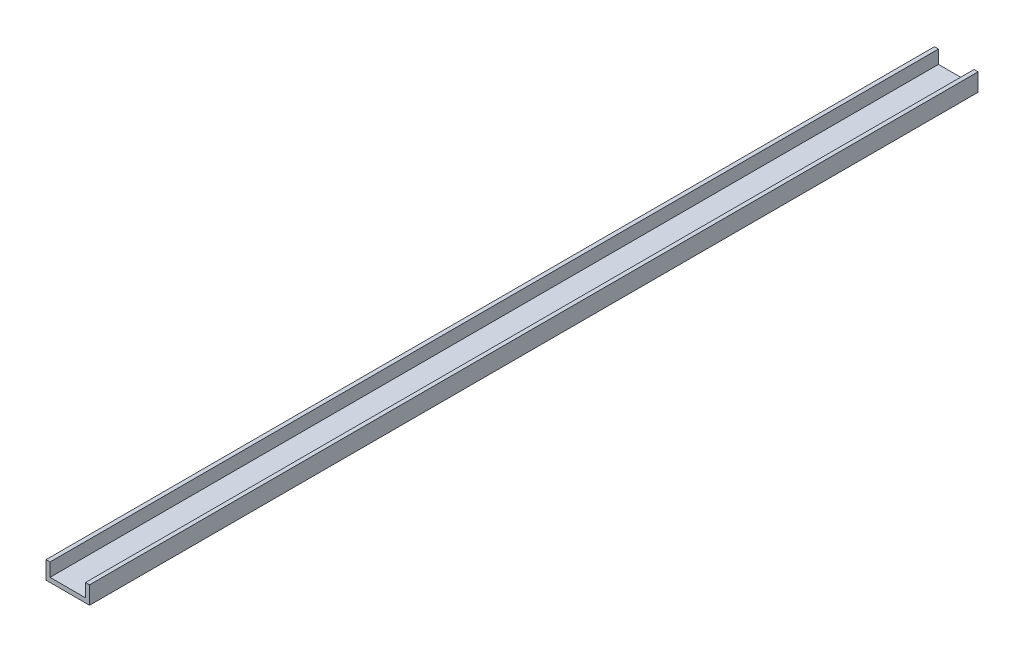
ISO-10303-21;
HEADER;
FILE_DESCRIPTION(('STEP AP214'),'2;1');
FILE_NAME('part.step','',(''),(''),'','','');
FILE_SCHEMA(('AUTOMOTIVE_DESIGN { 1 0 10303 214 1 1 1 1 }'));
ENDSEC;
DATA;
#1=APPLICATION_CONTEXT('core data for automotive mechanical design processes');
#2=APPLICATION_PROTOCOL_DEFINITION('international standard','automotive_design',2000,#1);
#3=PRODUCT_CONTEXT('',#1,'mechanical');
#4=PRODUCT('Part','Part','',(#3));
#5=PRODUCT_RELATED_PRODUCT_CATEGORY('part','',(#4));
#6=PRODUCT_DEFINITION_FORMATION('','',#4);
#7=PRODUCT_DEFINITION_CONTEXT('part definition',#1,'design');
#8=PRODUCT_DEFINITION('design','',#6,#7);
#9=PRODUCT_DEFINITION_SHAPE('','',#8);
#10=(LENGTH_UNIT() NAMED_UNIT(*) SI_UNIT(.MILLI.,.METRE.));
#11=(NAMED_UNIT(*) PLANE_ANGLE_UNIT() SI_UNIT($,.RADIAN.));
#12=(NAMED_UNIT(*) SI_UNIT($,.STERADIAN.) SOLID_ANGLE_UNIT());
#13=UNCERTAINTY_MEASURE_WITH_UNIT(LENGTH_MEASURE(1.E-05),#10,'distance_accuracy_value','');
#14=(GEOMETRIC_REPRESENTATION_CONTEXT(3) GLOBAL_UNCERTAINTY_ASSIGNED_CONTEXT((#13)) GLOBAL_UNIT_ASSIGNED_CONTEXT((#10,
#11,#12)) REPRESENTATION_CONTEXT('',''));
#15=CARTESIAN_POINT('',(0.,0.,0.));
#16=DIRECTION('',(0.,0.,1.));
#17=DIRECTION('',(1.,0.,0.));
#18=AXIS2_PLACEMENT_3D('',#15,#16,#17);
#19=CARTESIAN_POINT('',(-41.5259520884521,15.,1000.));
#20=DIRECTION('',(-1.,0.,0.));
#21=DIRECTION('',(0.,0.,1.));
#22=AXIS2_PLACEMENT_3D('',#19,#20,#21);
#23=PLANE('',#22);
#24=DIRECTION('',(0.,1.,0.));
#25=VECTOR('',#24,1.);
#26=CARTESIAN_POINT('',(-41.5259520884521,15.,0.));
#27=LINE('',#26,#25);
#28=CARTESIAN_POINT('',(-41.5259520884521,0.,0.));
#29=VERTEX_POINT('',#28);
#30=CARTESIAN_POINT('',(-41.5259520884521,15.,0.));
#31=VERTEX_POINT('',#30);
#32=EDGE_CURVE('E129',#29,#31,#27,.T.);
#33=ORIENTED_EDGE('',*,*,#32,.T.);
#34=DIRECTION('',(0.,0.,-1.));
#35=VECTOR('',#34,1.);
#36=CARTESIAN_POINT('',(-41.5259520884521,15.,1000.));
#37=LINE('',#36,#35);
#38=CARTESIAN_POINT('',(-41.5259520884521,15.,1000.));
#39=VERTEX_POINT('',#38);
#40=EDGE_CURVE('E11',#39,#31,#37,.T.);
#41=ORIENTED_EDGE('',*,*,#40,.F.);
#42=DIRECTION('',(0.,1.,0.));
#43=VECTOR('',#42,1.);
#44=CARTESIAN_POINT('',(-41.5259520884521,15.,1000.));
#45=LINE('',#44,#43);
#46=CARTESIAN_POINT('',(-41.5259520884521,0.,1000.));
#47=VERTEX_POINT('',#46);
#48=EDGE_CURVE('E143',#47,#39,#45,.T.);
#49=ORIENTED_EDGE('',*,*,#48,.F.);
#50=DIRECTION('',(0.,0.,-1.));
#51=VECTOR('',#50,1.);
#52=CARTESIAN_POINT('',(-41.5259520884521,0.,1000.));
#53=LINE('',#52,#51);
#54=EDGE_CURVE('E125',#47,#29,#53,.T.);
#55=ORIENTED_EDGE('',*,*,#54,.T.);
#56=EDGE_LOOP('',(#33,#41,#49,#55));
#57=FACE_BOUND('',#56,.T.);
#58=ADVANCED_FACE('F33',(#57),#23,.F.);
#59=CARTESIAN_POINT('',(-46.0259520884521,15.,1000.));
#60=DIRECTION('',(0.,-1.,0.));
#61=DIRECTION('',(1.,0.,0.));
#62=AXIS2_PLACEMENT_3D('',#59,#60,#61);
#63=PLANE('',#62);
#64=DIRECTION('',(-1.,0.,0.));
#65=VECTOR('',#64,1.);
#66=CARTESIAN_POINT('',(-46.0259520884521,15.,0.));
#67=LINE('',#66,#65);
#68=CARTESIAN_POINT('',(-46.0259520884521,15.,0.));
#69=VERTEX_POINT('',#68);
#70=EDGE_CURVE('E132',#31,#69,#67,.T.);
#71=ORIENTED_EDGE('',*,*,#70,.T.);
#72=DIRECTION('',(0.,0.,-1.));
#73=VECTOR('',#72,1.);
#74=CARTESIAN_POINT('',(-46.0259520884521,15.,1000.));
#75=LINE('',#74,#73);
#76=CARTESIAN_POINT('',(-46.0259520884521,15.,1000.));
#77=VERTEX_POINT('',#76);
#78=EDGE_CURVE('E41',#77,#69,#75,.T.);
#79=ORIENTED_EDGE('',*,*,#78,.F.);
#80=DIRECTION('',(-1.,0.,0.));
#81=VECTOR('',#80,1.);
#82=CARTESIAN_POINT('',(-46.0259520884521,15.,1000.));
#83=LINE('',#82,#81);
#84=EDGE_CURVE('E92',#39,#77,#83,.T.);
#85=ORIENTED_EDGE('',*,*,#84,.F.);
#86=ORIENTED_EDGE('',*,*,#40,.T.);
#87=EDGE_LOOP('',(#71,#79,#85,#86));
#88=FACE_BOUND('',#87,.T.);
#89=ADVANCED_FACE('F178',(#88),#63,.F.);
#90=CARTESIAN_POINT('',(-46.0259520884521,-5.00000000000001,1000.));
#91=DIRECTION('',(1.,0.,0.));
#92=DIRECTION('',(0.,0.,-1.));
#93=AXIS2_PLACEMENT_3D('',#90,#91,#92);
#94=PLANE('',#93);
#95=DIRECTION('',(0.,-1.,0.));
#96=VECTOR('',#95,1.);
#97=CARTESIAN_POINT('',(-46.0259520884521,-5.00000000000001,0.));
#98=LINE('',#97,#96);
#99=CARTESIAN_POINT('',(-46.0259520884521,-5.00000000000001,0.));
#100=VERTEX_POINT('',#99);
#101=EDGE_CURVE('E134',#69,#100,#98,.T.);
#102=ORIENTED_EDGE('',*,*,#101,.T.);
#103=DIRECTION('',(0.,0.,-1.));
#104=VECTOR('',#103,1.);
#105=CARTESIAN_POINT('',(-46.0259520884521,-5.00000000000001,1000.));
#106=LINE('',#105,#104);
#107=CARTESIAN_POINT('',(-46.0259520884521,-5.00000000000001,1000.));
#108=VERTEX_POINT('',#107);
#109=EDGE_CURVE('E150',#108,#100,#106,.T.);
#110=ORIENTED_EDGE('',*,*,#109,.F.);
#111=DIRECTION('',(0.,-1.,0.));
#112=VECTOR('',#111,1.);
#113=CARTESIAN_POINT('',(-46.0259520884521,-5.00000000000001,1000.));
#114=LINE('',#113,#112);
#115=EDGE_CURVE('E158',#77,#108,#114,.T.);
#116=ORIENTED_EDGE('',*,*,#115,.F.);
#117=ORIENTED_EDGE('',*,*,#78,.T.);
#118=EDGE_LOOP('',(#102,#110,#116,#117));
#119=FACE_BOUND('',#118,.T.);
#120=ADVANCED_FACE('F156',(#119),#94,.F.);
#121=CARTESIAN_POINT('',(2.97404791154792,-5.,1000.));
#122=DIRECTION('',(0.,1.,0.));
#123=DIRECTION('',(-1.,0.,0.));
#124=AXIS2_PLACEMENT_3D('',#121,#122,#123);
#125=PLANE('',#124);
#126=DIRECTION('',(1.,0.,0.));
#127=VECTOR('',#126,1.);
#128=CARTESIAN_POINT('',(2.97404791154792,-5.,0.));
#129=LINE('',#128,#127);
#130=CARTESIAN_POINT('',(2.97404791154792,-5.,0.));
#131=VERTEX_POINT('',#130);
#132=EDGE_CURVE('E136',#100,#131,#129,.T.);
#133=ORIENTED_EDGE('',*,*,#132,.T.);
#134=DIRECTION('',(0.,0.,-1.));
#135=VECTOR('',#134,1.);
#136=CARTESIAN_POINT('',(2.97404791154792,-5.,1000.));
#137=LINE('',#136,#135);
#138=CARTESIAN_POINT('',(2.97404791154792,-5.,1000.));
#139=VERTEX_POINT('',#138);
#140=EDGE_CURVE('E147',#139,#131,#137,.T.);
#141=ORIENTED_EDGE('',*,*,#140,.F.);
#142=DIRECTION('',(1.,0.,0.));
#143=VECTOR('',#142,1.);
#144=CARTESIAN_POINT('',(2.97404791154792,-5.,1000.));
#145=LINE('',#144,#143);
#146=EDGE_CURVE('E170',#108,#139,#145,.T.);
#147=ORIENTED_EDGE('',*,*,#146,.F.);
#148=ORIENTED_EDGE('',*,*,#109,.T.);
#149=EDGE_LOOP('',(#133,#141,#147,#148));
#150=FACE_BOUND('',#149,.T.);
#151=ADVANCED_FACE('F166',(#150),#125,.F.);
#152=CARTESIAN_POINT('',(2.97404791154792,15.,1000.));
#153=DIRECTION('',(-1.,0.,0.));
#154=DIRECTION('',(0.,-1.,0.));
#155=AXIS2_PLACEMENT_3D('',#152,#153,#154);
#156=PLANE('',#155);
#157=DIRECTION('',(0.,1.,0.));
#158=VECTOR('',#157,1.);
#159=CARTESIAN_POINT('',(2.97404791154792,15.,0.));
#160=LINE('',#159,#158);
#161=CARTESIAN_POINT('',(2.97404791154792,15.,0.));
#162=VERTEX_POINT('',#161);
#163=EDGE_CURVE('E138',#131,#162,#160,.T.);
#164=ORIENTED_EDGE('',*,*,#163,.T.);
#165=DIRECTION('',(0.,0.,-1.));
#166=VECTOR('',#165,1.);
#167=CARTESIAN_POINT('',(2.97404791154792,15.,1000.));
#168=LINE('',#167,#166);
#169=CARTESIAN_POINT('',(2.97404791154792,15.,1000.));
#170=VERTEX_POINT('',#169);
#171=EDGE_CURVE('E120',#170,#162,#168,.T.);
#172=ORIENTED_EDGE('',*,*,#171,.F.);
#173=DIRECTION('',(0.,1.,0.));
#174=VECTOR('',#173,1.);
#175=CARTESIAN_POINT('',(2.97404791154792,15.,1000.));
#176=LINE('',#175,#174);
#177=EDGE_CURVE('E111',#139,#170,#176,.T.);
#178=ORIENTED_EDGE('',*,*,#177,.F.);
#179=ORIENTED_EDGE('',*,*,#140,.T.);
#180=EDGE_LOOP('',(#164,#172,#178,#179));
#181=FACE_BOUND('',#180,.T.);
#182=ADVANCED_FACE('F169',(#181),#156,.F.);
#183=CARTESIAN_POINT('',(-1.52595208845208,15.,1000.));
#184=DIRECTION('',(0.,-1.,0.));
#185=DIRECTION('',(0.,0.,-1.));
#186=AXIS2_PLACEMENT_3D('',#183,#184,#185);
#187=PLANE('',#186);
#188=DIRECTION('',(-1.,0.,0.));
#189=VECTOR('',#188,1.);
#190=CARTESIAN_POINT('',(-1.52595208845208,15.,0.));
#191=LINE('',#190,#189);
#192=CARTESIAN_POINT('',(-1.52595208845208,15.,0.));
#193=VERTEX_POINT('',#192);
#194=EDGE_CURVE('E119',#162,#193,#191,.T.);
#195=ORIENTED_EDGE('',*,*,#194,.T.);
#196=DIRECTION('',(0.,0.,-1.));
#197=VECTOR('',#196,1.);
#198=CARTESIAN_POINT('',(-1.52595208845208,15.,1000.));
#199=LINE('',#198,#197);
#200=CARTESIAN_POINT('',(-1.52595208845208,15.,1000.));
#201=VERTEX_POINT('',#200);
#202=EDGE_CURVE('E116',#201,#193,#199,.T.);
#203=ORIENTED_EDGE('',*,*,#202,.F.);
#204=DIRECTION('',(-1.,0.,0.));
#205=VECTOR('',#204,1.);
#206=CARTESIAN_POINT('',(-1.52595208845208,15.,1000.));
#207=LINE('',#206,#205);
#208=EDGE_CURVE('E105',#170,#201,#207,.T.);
#209=ORIENTED_EDGE('',*,*,#208,.F.);
#210=ORIENTED_EDGE('',*,*,#171,.T.);
#211=EDGE_LOOP('',(#195,#203,#209,#210));
#212=FACE_BOUND('',#211,.T.);
#213=ADVANCED_FACE('F117',(#212),#187,.F.);
#214=CARTESIAN_POINT('',(-1.52595208845208,0.,1000.));
#215=DIRECTION('',(1.,0.,0.));
#216=DIRECTION('',(0.,0.,-1.));
#217=AXIS2_PLACEMENT_3D('',#214,#215,#216);
#218=PLANE('',#217);
#219=DIRECTION('',(0.,-1.,0.));
#220=VECTOR('',#219,1.);
#221=CARTESIAN_POINT('',(-1.52595208845208,0.,0.));
#222=LINE('',#221,#220);
#223=CARTESIAN_POINT('',(-1.52595208845208,0.,0.));
#224=VERTEX_POINT('',#223);
#225=EDGE_CURVE('E78',#193,#224,#222,.T.);
#226=ORIENTED_EDGE('',*,*,#225,.T.);
#227=DIRECTION('',(0.,0.,-1.));
#228=VECTOR('',#227,1.);
#229=CARTESIAN_POINT('',(-1.52595208845208,0.,1000.));
#230=LINE('',#229,#228);
#231=CARTESIAN_POINT('',(-1.52595208845208,0.,1000.));
#232=VERTEX_POINT('',#231);
#233=EDGE_CURVE('E121',#232,#224,#230,.T.);
#234=ORIENTED_EDGE('',*,*,#233,.F.);
#235=DIRECTION('',(0.,-1.,0.));
#236=VECTOR('',#235,1.);
#237=CARTESIAN_POINT('',(-1.52595208845208,0.,1000.));
#238=LINE('',#237,#236);
#239=EDGE_CURVE('E109',#201,#232,#238,.T.);
#240=ORIENTED_EDGE('',*,*,#239,.F.);
#241=ORIENTED_EDGE('',*,*,#202,.T.);
#242=EDGE_LOOP('',(#226,#234,#240,#241));
#243=FACE_BOUND('',#242,.T.);
#244=ADVANCED_FACE('F123',(#243),#218,.F.);
#245=CARTESIAN_POINT('',(-41.5259520884521,0.,1000.));
#246=DIRECTION('',(0.,-1.,0.));
#247=DIRECTION('',(0.,0.,-1.));
#248=AXIS2_PLACEMENT_3D('',#245,#246,#247);
#249=PLANE('',#248);
#250=DIRECTION('',(-1.,0.,0.));
#251=VECTOR('',#250,1.);
#252=CARTESIAN_POINT('',(-41.5259520884521,0.,0.));
#253=LINE('',#252,#251);
#254=EDGE_CURVE('E84',#224,#29,#253,.T.);
#255=ORIENTED_EDGE('',*,*,#254,.T.);
#256=ORIENTED_EDGE('',*,*,#54,.F.);
#257=DIRECTION('',(-1.,0.,0.));
#258=VECTOR('',#257,1.);
#259=CARTESIAN_POINT('',(-41.5259520884521,0.,1000.));
#260=LINE('',#259,#258);
#261=EDGE_CURVE('E49',#232,#47,#260,.T.);
#262=ORIENTED_EDGE('',*,*,#261,.F.);
#263=ORIENTED_EDGE('',*,*,#233,.T.);
#264=EDGE_LOOP('',(#255,#256,#262,#263));
#265=FACE_BOUND('',#264,.T.);
#266=ADVANCED_FACE('F194',(#265),#249,.F.);
#267=CARTESIAN_POINT('',(0.,0.,1000.));
#268=DIRECTION('',(0.,0.,1.));
#269=DIRECTION('',(1.,0.,0.));
#270=AXIS2_PLACEMENT_3D('',#267,#268,#269);
#271=PLANE('',#270);
#272=ORIENTED_EDGE('',*,*,#48,.T.);
#273=ORIENTED_EDGE('',*,*,#84,.T.);
#274=ORIENTED_EDGE('',*,*,#115,.T.);
#275=ORIENTED_EDGE('',*,*,#146,.T.);
#276=ORIENTED_EDGE('',*,*,#177,.T.);
#277=ORIENTED_EDGE('',*,*,#208,.T.);
#278=ORIENTED_EDGE('',*,*,#239,.T.);
#279=ORIENTED_EDGE('',*,*,#261,.T.);
#280=EDGE_LOOP('',(#272,#273,#274,#275,#276,#277,#278,#279));
#281=FACE_BOUND('',#280,.T.);
#282=ADVANCED_FACE('F107',(#281),#271,.T.);
#283=CARTESIAN_POINT('',(0.,0.,0.));
#284=DIRECTION('',(0.,0.,1.));
#285=DIRECTION('',(1.,0.,0.));
#286=AXIS2_PLACEMENT_3D('',#283,#284,#285);
#287=PLANE('',#286);
#288=ORIENTED_EDGE('',*,*,#32,.F.);
#289=ORIENTED_EDGE('',*,*,#254,.F.);
#290=ORIENTED_EDGE('',*,*,#225,.F.);
#291=ORIENTED_EDGE('',*,*,#194,.F.);
#292=ORIENTED_EDGE('',*,*,#163,.F.);
#293=ORIENTED_EDGE('',*,*,#132,.F.);
#294=ORIENTED_EDGE('',*,*,#101,.F.);
#295=ORIENTED_EDGE('',*,*,#70,.F.);
#296=EDGE_LOOP('',(#288,#289,#290,#291,#292,#293,#294,#295));
#297=FACE_BOUND('',#296,.T.);
#298=ADVANCED_FACE('F162',(#297),#287,.F.);
#299=CLOSED_SHELL('',(#58,#89,#120,#151,#182,#213,#244,#266,#282,#298));
#300=MANIFOLD_SOLID_BREP('B2',#299);
#301=ADVANCED_BREP_SHAPE_REPRESENTATION('',(#18,#300),#14);
#302=SHAPE_DEFINITION_REPRESENTATION(#9,#301);
ENDSEC;
END-ISO-10303-21;
